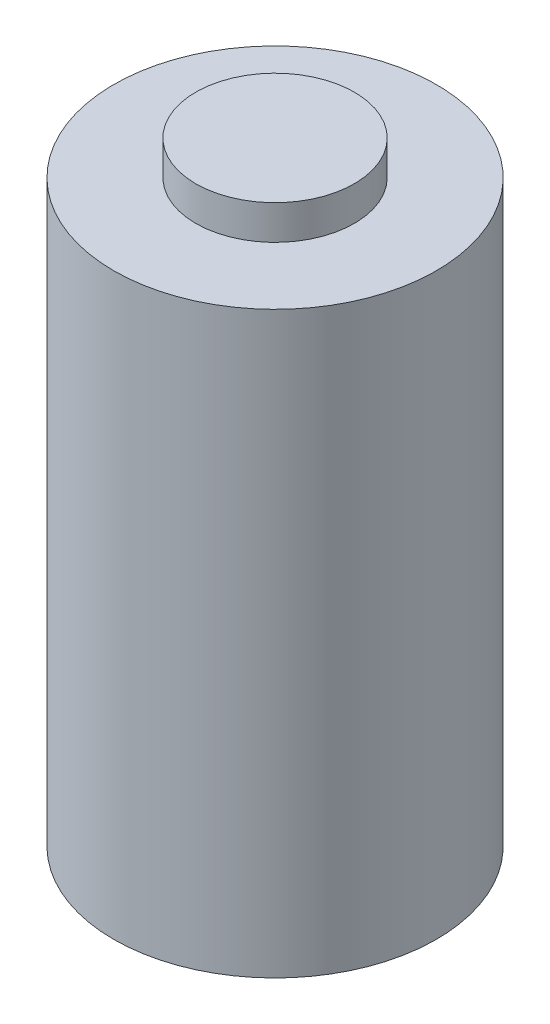
ISO-10303-21;
HEADER;
FILE_DESCRIPTION(('STEP AP214'),'2;1');
FILE_NAME('part.step','',(''),(''),'','','');
FILE_SCHEMA(('AUTOMOTIVE_DESIGN { 1 0 10303 214 1 1 1 1 }'));
ENDSEC;
DATA;
#1=APPLICATION_CONTEXT('core data for automotive mechanical design processes');
#2=APPLICATION_PROTOCOL_DEFINITION('international standard','automotive_design',2000,#1);
#3=PRODUCT_CONTEXT('',#1,'mechanical');
#4=PRODUCT('Part','Part','',(#3));
#5=PRODUCT_RELATED_PRODUCT_CATEGORY('part','',(#4));
#6=PRODUCT_DEFINITION_FORMATION('','',#4);
#7=PRODUCT_DEFINITION_CONTEXT('part definition',#1,'design');
#8=PRODUCT_DEFINITION('design','',#6,#7);
#9=PRODUCT_DEFINITION_SHAPE('','',#8);
#10=(LENGTH_UNIT() NAMED_UNIT(*) SI_UNIT(.MILLI.,.METRE.));
#11=(NAMED_UNIT(*) PLANE_ANGLE_UNIT() SI_UNIT($,.RADIAN.));
#12=(NAMED_UNIT(*) SI_UNIT($,.STERADIAN.) SOLID_ANGLE_UNIT());
#13=UNCERTAINTY_MEASURE_WITH_UNIT(LENGTH_MEASURE(1.E-05),#10,'distance_accuracy_value','');
#14=(GEOMETRIC_REPRESENTATION_CONTEXT(3) GLOBAL_UNCERTAINTY_ASSIGNED_CONTEXT((#13)) GLOBAL_UNIT_ASSIGNED_CONTEXT((#10,
#11,#12)) REPRESENTATION_CONTEXT('',''));
#15=CARTESIAN_POINT('',(0.,0.,0.));
#16=DIRECTION('',(0.,0.,1.));
#17=DIRECTION('',(1.,0.,0.));
#18=AXIS2_PLACEMENT_3D('',#15,#16,#17);
#19=CARTESIAN_POINT('',(0.,43.8,0.));
#20=DIRECTION('',(0.,-1.,0.));
#21=DIRECTION('',(0.,0.,-1.));
#22=AXIS2_PLACEMENT_3D('',#19,#20,#21);
#23=CYLINDRICAL_SURFACE('',#22,12.2);
#24=CARTESIAN_POINT('',(0.,43.8,0.));
#25=DIRECTION('',(0.,1.,0.));
#26=DIRECTION('',(0.,0.,1.));
#27=AXIS2_PLACEMENT_3D('',#24,#25,#26);
#28=CIRCLE('',#27,12.2);
#29=CARTESIAN_POINT('',(0.,43.8,12.2));
#30=VERTEX_POINT('',#29);
#31=EDGE_CURVE('E48',#30,#30,#28,.T.);
#32=ORIENTED_EDGE('',*,*,#31,.F.);
#33=EDGE_LOOP('',(#32));
#34=FACE_BOUND('',#33,.T.);
#35=CARTESIAN_POINT('',(0.,0.,0.));
#36=DIRECTION('',(0.,1.,0.));
#37=DIRECTION('',(0.,0.,1.));
#38=AXIS2_PLACEMENT_3D('',#35,#36,#37);
#39=CIRCLE('',#38,12.2);
#40=CARTESIAN_POINT('',(0.,0.,12.2));
#41=VERTEX_POINT('',#40);
#42=EDGE_CURVE('E44',#41,#41,#39,.T.);
#43=ORIENTED_EDGE('',*,*,#42,.T.);
#44=EDGE_LOOP('',(#43));
#45=FACE_BOUND('',#44,.T.);
#46=ADVANCED_FACE('F41',(#34,#45),#23,.T.);
#47=CARTESIAN_POINT('',(0.,43.8,0.));
#48=DIRECTION('',(0.,1.,0.));
#49=DIRECTION('',(0.,0.,1.));
#50=AXIS2_PLACEMENT_3D('',#47,#48,#49);
#51=PLANE('',#50);
#52=CARTESIAN_POINT('',(0.,43.8,0.));
#53=DIRECTION('',(0.,1.,0.));
#54=DIRECTION('',(0.,0.,1.));
#55=AXIS2_PLACEMENT_3D('',#52,#53,#54);
#56=CIRCLE('',#55,6.);
#57=CARTESIAN_POINT('',(0.,43.8,6.));
#58=VERTEX_POINT('',#57);
#59=EDGE_CURVE('E10',#58,#58,#56,.T.);
#60=ORIENTED_EDGE('',*,*,#59,.F.);
#61=EDGE_LOOP('',(#60));
#62=FACE_BOUND('',#61,.T.);
#63=ORIENTED_EDGE('',*,*,#31,.T.);
#64=EDGE_LOOP('',(#63));
#65=FACE_BOUND('',#64,.T.);
#66=ADVANCED_FACE('F65',(#62,#65),#51,.T.);
#67=CARTESIAN_POINT('',(0.,0.,0.));
#68=DIRECTION('',(0.,1.,0.));
#69=DIRECTION('',(0.,0.,1.));
#70=AXIS2_PLACEMENT_3D('',#67,#68,#69);
#71=PLANE('',#70);
#72=ORIENTED_EDGE('',*,*,#42,.F.);
#73=EDGE_LOOP('',(#72));
#74=FACE_BOUND('',#73,.T.);
#75=ADVANCED_FACE('F62',(#74),#71,.F.);
#76=CARTESIAN_POINT('',(0.,46.4,0.));
#77=DIRECTION('',(0.,-1.,0.));
#78=DIRECTION('',(0.,0.,-1.));
#79=AXIS2_PLACEMENT_3D('',#76,#77,#78);
#80=CYLINDRICAL_SURFACE('',#79,6.);
#81=CARTESIAN_POINT('',(0.,46.4,0.));
#82=DIRECTION('',(0.,1.,0.));
#83=DIRECTION('',(0.,0.,1.));
#84=AXIS2_PLACEMENT_3D('',#81,#82,#83);
#85=CIRCLE('',#84,6.);
#86=CARTESIAN_POINT('',(0.,46.4,6.));
#87=VERTEX_POINT('',#86);
#88=EDGE_CURVE('E54',#87,#87,#85,.T.);
#89=ORIENTED_EDGE('',*,*,#88,.F.);
#90=EDGE_LOOP('',(#89));
#91=FACE_BOUND('',#90,.T.);
#92=ORIENTED_EDGE('',*,*,#59,.T.);
#93=EDGE_LOOP('',(#92));
#94=FACE_BOUND('',#93,.T.);
#95=ADVANCED_FACE('F64',(#91,#94),#80,.T.);
#96=CARTESIAN_POINT('',(0.,46.4,0.));
#97=DIRECTION('',(0.,1.,0.));
#98=DIRECTION('',(0.,0.,1.));
#99=AXIS2_PLACEMENT_3D('',#96,#97,#98);
#100=PLANE('',#99);
#101=ORIENTED_EDGE('',*,*,#88,.T.);
#102=EDGE_LOOP('',(#101));
#103=FACE_BOUND('',#102,.T.);
#104=ADVANCED_FACE('F71',(#103),#100,.T.);
#105=CLOSED_SHELL('',(#46,#66,#75,#95,#104));
#106=MANIFOLD_SOLID_BREP('B2',#105);
#107=ADVANCED_BREP_SHAPE_REPRESENTATION('',(#18,#106),#14);
#108=SHAPE_DEFINITION_REPRESENTATION(#9,#107);
ENDSEC;
END-ISO-10303-21;
